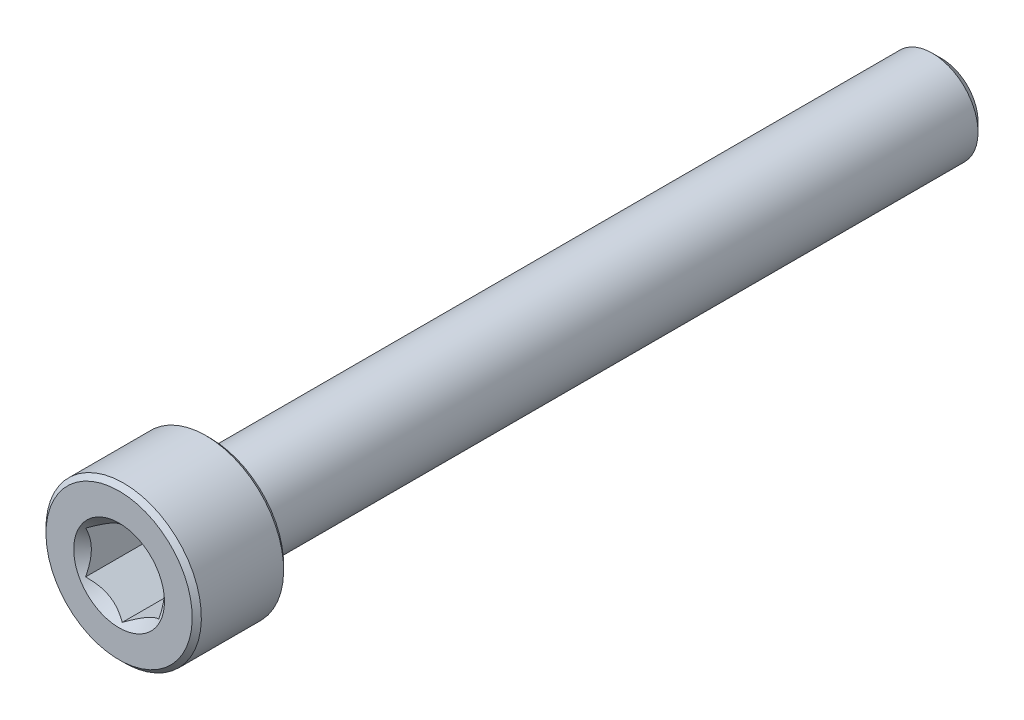
ISO-10303-21;
HEADER;
FILE_DESCRIPTION(('STEP AP214'),'2;1');
FILE_NAME('part.step','',(''),(''),'','','');
FILE_SCHEMA(('AUTOMOTIVE_DESIGN { 1 0 10303 214 1 1 1 1 }'));
ENDSEC;
DATA;
#1=APPLICATION_CONTEXT('core data for automotive mechanical design processes');
#2=APPLICATION_PROTOCOL_DEFINITION('international standard','automotive_design',2000,#1);
#3=PRODUCT_CONTEXT('',#1,'mechanical');
#4=PRODUCT('Part','Part','',(#3));
#5=PRODUCT_RELATED_PRODUCT_CATEGORY('part','',(#4));
#6=PRODUCT_DEFINITION_FORMATION('','',#4);
#7=PRODUCT_DEFINITION_CONTEXT('part definition',#1,'design');
#8=PRODUCT_DEFINITION('design','',#6,#7);
#9=PRODUCT_DEFINITION_SHAPE('','',#8);
#10=(LENGTH_UNIT() NAMED_UNIT(*) SI_UNIT(.MILLI.,.METRE.));
#11=(NAMED_UNIT(*) PLANE_ANGLE_UNIT() SI_UNIT($,.RADIAN.));
#12=(NAMED_UNIT(*) SI_UNIT($,.STERADIAN.) SOLID_ANGLE_UNIT());
#13=UNCERTAINTY_MEASURE_WITH_UNIT(LENGTH_MEASURE(1.E-05),#10,'distance_accuracy_value','');
#14=(GEOMETRIC_REPRESENTATION_CONTEXT(3) GLOBAL_UNCERTAINTY_ASSIGNED_CONTEXT((#13)) GLOBAL_UNIT_ASSIGNED_CONTEXT((#10,
#11,#12)) REPRESENTATION_CONTEXT('',''));
#15=CARTESIAN_POINT('',(0.,0.,0.));
#16=DIRECTION('',(0.,0.,1.));
#17=DIRECTION('',(1.,0.,0.));
#18=AXIS2_PLACEMENT_3D('',#15,#16,#17);
#19=CARTESIAN_POINT('',(0.,1.98038475772934,-22.5));
#20=DIRECTION('',(0.,0.,-1.));
#21=DIRECTION('',(0.,1.,0.));
#22=AXIS2_PLACEMENT_3D('',#19,#20,#21);
#23=PLANE('',#22);
#24=CARTESIAN_POINT('',(0.,0.,-22.5));
#25=DIRECTION('',(0.,0.,-1.));
#26=DIRECTION('',(0.,1.,0.));
#27=AXIS2_PLACEMENT_3D('',#24,#25,#26);
#28=CIRCLE('',#27,1.98038475772934);
#29=CARTESIAN_POINT('',(0.,1.98038475772934,-22.5));
#30=VERTEX_POINT('',#29);
#31=EDGE_CURVE('E61',#30,#30,#28,.T.);
#32=ORIENTED_EDGE('',*,*,#31,.T.);
#33=EDGE_LOOP('',(#32));
#34=FACE_BOUND('',#33,.T.);
#35=ADVANCED_FACE('F47',(#34),#23,.T.);
#36=CARTESIAN_POINT('',(0.,0.,-22.5));
#37=DIRECTION('',(0.,0.,1.));
#38=DIRECTION('',(0.,-1.,0.));
#39=AXIS2_PLACEMENT_3D('',#36,#37,#38);
#40=CONICAL_SURFACE('',#39,1.98038475772934,0.785398163397447);
#41=CARTESIAN_POINT('',(0.,0.,-21.9803847577293));
#42=DIRECTION('',(0.,0.,-1.));
#43=DIRECTION('',(0.,1.,0.));
#44=AXIS2_PLACEMENT_3D('',#41,#42,#43);
#45=CIRCLE('',#44,2.5);
#46=CARTESIAN_POINT('',(0.,2.5,-21.9803847577293));
#47=VERTEX_POINT('',#46);
#48=EDGE_CURVE('E179',#47,#47,#45,.T.);
#49=ORIENTED_EDGE('',*,*,#48,.T.);
#50=EDGE_LOOP('',(#49));
#51=FACE_BOUND('',#50,.T.);
#52=ORIENTED_EDGE('',*,*,#31,.F.);
#53=EDGE_LOOP('',(#52));
#54=FACE_BOUND('',#53,.T.);
#55=ADVANCED_FACE('F187',(#51,#54),#40,.T.);
#56=CARTESIAN_POINT('',(0.,0.,-22.5));
#57=DIRECTION('',(0.,0.,-1.));
#58=DIRECTION('',(0.,1.,0.));
#59=AXIS2_PLACEMENT_3D('',#56,#57,#58);
#60=CYLINDRICAL_SURFACE('',#59,2.5);
#61=CARTESIAN_POINT('',(0.,0.,17.25));
#62=DIRECTION('',(0.,0.,-1.));
#63=DIRECTION('',(0.,1.,0.));
#64=AXIS2_PLACEMENT_3D('',#61,#62,#63);
#65=CIRCLE('',#64,2.5);
#66=CARTESIAN_POINT('',(0.,2.5,17.25));
#67=VERTEX_POINT('',#66);
#68=EDGE_CURVE('E175',#67,#67,#65,.T.);
#69=ORIENTED_EDGE('',*,*,#68,.T.);
#70=EDGE_LOOP('',(#69));
#71=FACE_BOUND('',#70,.T.);
#72=ORIENTED_EDGE('',*,*,#48,.F.);
#73=EDGE_LOOP('',(#72));
#74=FACE_BOUND('',#73,.T.);
#75=ADVANCED_FACE('F189',(#71,#74),#60,.T.);
#76=CARTESIAN_POINT('',(0.,0.,17.25));
#77=DIRECTION('',(0.,0.,-1.));
#78=DIRECTION('',(0.,1.,0.));
#79=AXIS2_PLACEMENT_3D('',#76,#77,#78);
#80=TOROIDAL_SURFACE('',#79,2.75,0.25);
#81=CARTESIAN_POINT('',(0.,0.,17.5));
#82=DIRECTION('',(0.,0.,-1.));
#83=DIRECTION('',(0.,1.,0.));
#84=AXIS2_PLACEMENT_3D('',#81,#82,#83);
#85=CIRCLE('',#84,2.75);
#86=CARTESIAN_POINT('',(0.,2.75,17.5));
#87=VERTEX_POINT('',#86);
#88=EDGE_CURVE('E171',#87,#87,#85,.T.);
#89=ORIENTED_EDGE('',*,*,#88,.T.);
#90=EDGE_LOOP('',(#89));
#91=FACE_BOUND('',#90,.T.);
#92=ORIENTED_EDGE('',*,*,#68,.F.);
#93=EDGE_LOOP('',(#92));
#94=FACE_BOUND('',#93,.T.);
#95=ADVANCED_FACE('F195',(#91,#94),#80,.F.);
#96=CARTESIAN_POINT('',(0.,4.,17.5));
#97=DIRECTION('',(0.,0.,-1.));
#98=DIRECTION('',(0.,1.,0.));
#99=AXIS2_PLACEMENT_3D('',#96,#97,#98);
#100=PLANE('',#99);
#101=CARTESIAN_POINT('',(0.,0.,17.5));
#102=DIRECTION('',(0.,0.,-1.));
#103=DIRECTION('',(0.,1.,0.));
#104=AXIS2_PLACEMENT_3D('',#101,#102,#103);
#105=CIRCLE('',#104,4.);
#106=CARTESIAN_POINT('',(0.,4.,17.5));
#107=VERTEX_POINT('',#106);
#108=EDGE_CURVE('E167',#107,#107,#105,.T.);
#109=ORIENTED_EDGE('',*,*,#108,.T.);
#110=EDGE_LOOP('',(#109));
#111=FACE_BOUND('',#110,.T.);
#112=ORIENTED_EDGE('',*,*,#88,.F.);
#113=EDGE_LOOP('',(#112));
#114=FACE_BOUND('',#113,.T.);
#115=ADVANCED_FACE('F201',(#111,#114),#100,.T.);
#116=CARTESIAN_POINT('',(0.,0.,17.5));
#117=DIRECTION('',(0.,0.,1.));
#118=DIRECTION('',(0.,-1.,0.));
#119=AXIS2_PLACEMENT_3D('',#116,#117,#118);
#120=CONICAL_SURFACE('',#119,4.,0.785398163397448);
#121=CARTESIAN_POINT('',(0.,0.,17.75));
#122=DIRECTION('',(0.,0.,-1.));
#123=DIRECTION('',(0.,1.,0.));
#124=AXIS2_PLACEMENT_3D('',#121,#122,#123);
#125=CIRCLE('',#124,4.25);
#126=CARTESIAN_POINT('',(0.,4.25,17.75));
#127=VERTEX_POINT('',#126);
#128=EDGE_CURVE('E163',#127,#127,#125,.T.);
#129=ORIENTED_EDGE('',*,*,#128,.T.);
#130=EDGE_LOOP('',(#129));
#131=FACE_BOUND('',#130,.T.);
#132=ORIENTED_EDGE('',*,*,#108,.F.);
#133=EDGE_LOOP('',(#132));
#134=FACE_BOUND('',#133,.T.);
#135=ADVANCED_FACE('F205',(#131,#134),#120,.T.);
#136=CARTESIAN_POINT('',(0.,0.,-22.5));
#137=DIRECTION('',(0.,0.,-1.));
#138=DIRECTION('',(0.,1.,0.));
#139=AXIS2_PLACEMENT_3D('',#136,#137,#138);
#140=CYLINDRICAL_SURFACE('',#139,4.25);
#141=CARTESIAN_POINT('',(0.,0.,22.25));
#142=DIRECTION('',(0.,0.,-1.));
#143=DIRECTION('',(0.,1.,0.));
#144=AXIS2_PLACEMENT_3D('',#141,#142,#143);
#145=CIRCLE('',#144,4.25);
#146=CARTESIAN_POINT('',(0.,4.25,22.25));
#147=VERTEX_POINT('',#146);
#148=EDGE_CURVE('E159',#147,#147,#145,.T.);
#149=ORIENTED_EDGE('',*,*,#148,.T.);
#150=EDGE_LOOP('',(#149));
#151=FACE_BOUND('',#150,.T.);
#152=ORIENTED_EDGE('',*,*,#128,.F.);
#153=EDGE_LOOP('',(#152));
#154=FACE_BOUND('',#153,.T.);
#155=ADVANCED_FACE('F209',(#151,#154),#140,.T.);
#156=CARTESIAN_POINT('',(0.,0.,22.25));
#157=DIRECTION('',(0.,0.,-1.));
#158=DIRECTION('',(0.,1.,0.));
#159=AXIS2_PLACEMENT_3D('',#156,#157,#158);
#160=CONICAL_SURFACE('',#159,4.25,0.785398163397448);
#161=CARTESIAN_POINT('',(0.,0.,22.5));
#162=DIRECTION('',(0.,0.,-1.));
#163=DIRECTION('',(0.,1.,0.));
#164=AXIS2_PLACEMENT_3D('',#161,#162,#163);
#165=CIRCLE('',#164,4.);
#166=CARTESIAN_POINT('',(0.,4.,22.5));
#167=VERTEX_POINT('',#166);
#168=EDGE_CURVE('E155',#167,#167,#165,.T.);
#169=ORIENTED_EDGE('',*,*,#168,.T.);
#170=EDGE_LOOP('',(#169));
#171=FACE_BOUND('',#170,.T.);
#172=ORIENTED_EDGE('',*,*,#148,.F.);
#173=EDGE_LOOP('',(#172));
#174=FACE_BOUND('',#173,.T.);
#175=ADVANCED_FACE('F213',(#171,#174),#160,.T.);
#176=CARTESIAN_POINT('',(0.,0.,22.5));
#177=DIRECTION('',(0.,0.,1.));
#178=DIRECTION('',(0.,-1.,0.));
#179=AXIS2_PLACEMENT_3D('',#176,#177,#178);
#180=PLANE('',#179);
#181=CARTESIAN_POINT('',(0.,0.,22.5));
#182=DIRECTION('',(0.,0.,1.));
#183=DIRECTION('',(1.,0.,0.));
#184=AXIS2_PLACEMENT_3D('',#181,#182,#183);
#185=CIRCLE('',#184,2.48260615751539);
#186=CARTESIAN_POINT('',(2.48260615751539,0.,22.5));
#187=VERTEX_POINT('',#186);
#188=EDGE_CURVE('E121',#187,#187,#185,.T.);
#189=ORIENTED_EDGE('',*,*,#188,.F.);
#190=EDGE_LOOP('',(#189));
#191=FACE_BOUND('',#190,.T.);
#192=ORIENTED_EDGE('',*,*,#168,.F.);
#193=EDGE_LOOP('',(#192));
#194=FACE_BOUND('',#193,.T.);
#195=ADVANCED_FACE('F217',(#191,#194),#180,.T.);
#196=CARTESIAN_POINT('',(0.,0.,22.5));
#197=DIRECTION('',(0.,0.,1.));
#198=DIRECTION('',(1.,0.,0.));
#199=AXIS2_PLACEMENT_3D('',#196,#197,#198);
#200=CONICAL_SURFACE('',#199,2.48260615751539,0.78539816339745);
#201=ORIENTED_EDGE('',*,*,#188,.T.);
#202=EDGE_LOOP('',(#201));
#203=FACE_BOUND('',#202,.T.);
#204=CARTESIAN_POINT('',(-0.000199999999999327,-2.30951654681234,22.3269103979568));
#205=CARTESIAN_POINT('',(0.0685530340307063,-2.26982196410711,22.2872480094687));
#206=CARTESIAN_POINT('',(0.138455742135512,-2.22946361676572,22.2499149015273));
#207=CARTESIAN_POINT('',(0.280995244550436,-2.1471683966763,22.1815586043793));
#208=CARTESIAN_POINT('',(0.353645597565358,-2.10522369580642,22.1505734529803));
#209=CARTESIAN_POINT('',(0.500141601053971,-2.02064418875706,22.0974951357873));
#210=CARTESIAN_POINT('',(0.573949935246294,-1.97803092714269,22.0752685464197));
#211=CARTESIAN_POINT('',(0.723191631835263,-1.89186619344273,22.0410237359182));
#212=CARTESIAN_POINT('',(0.798620433918151,-1.84831735425552,22.0289799483872));
#213=CARTESIAN_POINT('',(0.928615500671078,-1.7732646674724,22.0181134311487));
#214=CARTESIAN_POINT('',(0.983013783970107,-1.74185780396625,22.0165046728531));
#215=CARTESIAN_POINT('',(1.09172145551969,-1.67909540053412,22.0192137968418));
#216=CARTESIAN_POINT('',(1.14603080592134,-1.64773988246022,22.0235337570011));
#217=CARTESIAN_POINT('',(1.25413672758934,-1.5853248994842,22.037854486653));
#218=CARTESIAN_POINT('',(1.30793265655479,-1.55426580541469,22.0478616120051));
#219=CARTESIAN_POINT('',(1.41459426230557,-1.49268469862228,22.0730073494928));
#220=CARTESIAN_POINT('',(1.46746001007071,-1.46216264491917,22.0881455682853));
#221=CARTESIAN_POINT('',(1.60287973308984,-1.38397803138049,22.1330894226723));
#222=CARTESIAN_POINT('',(1.68459383484948,-1.33680037273297,22.1662837586689));
#223=CARTESIAN_POINT('',(1.8047470372578,-1.26742988897853,22.2223207424145));
#224=CARTESIAN_POINT('',(1.84434285210918,-1.24456923461531,22.2420096221901));
#225=CARTESIAN_POINT('',(1.92280095888787,-1.19927142554652,22.283182237608));
#226=CARTESIAN_POINT('',(1.96166368359374,-1.17683402097614,22.3046648708944));
#227=CARTESIAN_POINT('',(2.0002,-1.15458506832541,22.3269103979568));
#228=B_SPLINE_CURVE_WITH_KNOTS('',3,(#204,#205,#206,#207,#208,#209,#210,#211,#212,#213,#214,
#215,#216,#217,#218,#219,#220,#221,#222,#223,#224,#225,#226,#227),.UNSPECIFIED.,.F.,.F.,(4,2,2,
2,2,2,2,2,2,2,2,4),(0.,0.266420613771063,0.534393751523388,0.798110374376913,1.06116288956936,
1.24939906803721,1.43770123566247,1.62621426093931,1.81471283831913,2.11415604834144,
2.2634717071779,2.41269626969771),.UNSPECIFIED.);
#229=CARTESIAN_POINT('',(0.,-2.3094010767585,22.3267949192431));
#230=VERTEX_POINT('',#229);
#231=CARTESIAN_POINT('',(2.,-1.15470053837925,22.3267949192431));
#232=VERTEX_POINT('',#231);
#233=EDGE_CURVE('E12',#230,#232,#228,.T.);
#234=ORIENTED_EDGE('',*,*,#233,.F.);
#235=CARTESIAN_POINT('',(-2.0002,-1.15458506832541,22.3269103979568));
#236=CARTESIAN_POINT('',(-1.93144696596929,-1.19427965103064,22.2872480094687));
#237=CARTESIAN_POINT('',(-1.86154425786449,-1.23463799837204,22.2499149015273));
#238=CARTESIAN_POINT('',(-1.71900475544956,-1.31693321846145,22.1815586043793));
#239=CARTESIAN_POINT('',(-1.64635440243464,-1.35887791933134,22.1505734529803));
#240=CARTESIAN_POINT('',(-1.49985839894603,-1.44345742638069,22.0974951357873));
#241=CARTESIAN_POINT('',(-1.42605006475371,-1.48607068799507,22.0752685464197));
#242=CARTESIAN_POINT('',(-1.27680836816474,-1.57223542169503,22.0410237359182));
#243=CARTESIAN_POINT('',(-1.20137956608185,-1.61578426088223,22.0289799483872));
#244=CARTESIAN_POINT('',(-1.07138449932892,-1.69083694766536,22.0181134311487));
#245=CARTESIAN_POINT('',(-1.01698621602989,-1.72224381117151,22.0165046728531));
#246=CARTESIAN_POINT('',(-0.908278544480307,-1.78500621460364,22.0192137968418));
#247=CARTESIAN_POINT('',(-0.853969194078661,-1.81636173267754,22.0235337570011));
#248=CARTESIAN_POINT('',(-0.745863272410662,-1.87877671565355,22.037854486653));
#249=CARTESIAN_POINT('',(-0.692067343445208,-1.90983580972306,22.0478616120051));
#250=CARTESIAN_POINT('',(-0.585405737694426,-1.97141691651547,22.0730073494928));
#251=CARTESIAN_POINT('',(-0.532539989929288,-2.00193897021859,22.0881455682854));
#252=CARTESIAN_POINT('',(-0.397120266910156,-2.08012358375727,22.1330894226723));
#253=CARTESIAN_POINT('',(-0.315406165150521,-2.12730124240478,22.1662837586689));
#254=CARTESIAN_POINT('',(-0.195252962742196,-2.19667172615922,22.2223207424145));
#255=CARTESIAN_POINT('',(-0.155657147890821,-2.21953238052245,22.2420096221901));
#256=CARTESIAN_POINT('',(-0.0771990411121255,-2.26483018959124,22.283182237608));
#257=CARTESIAN_POINT('',(-0.0383363164062574,-2.28726759416161,22.3046648708944));
#258=CARTESIAN_POINT('',(0.000200000000001438,-2.30951654681234,22.3269103979568));
#259=B_SPLINE_CURVE_WITH_KNOTS('',3,(#235,#236,#237,#238,#239,#240,#241,#242,#243,#244,#245,
#246,#247,#248,#249,#250,#251,#252,#253,#254,#255,#256,#257,#258),.UNSPECIFIED.,.F.,.F.,(4,2,2,
2,2,2,2,2,2,2,2,4),(0.,0.266420613771063,0.534393751523387,0.798110374376912,1.06116288956936,
1.24939906803721,1.43770123566247,1.62621426093931,1.81471283831913,2.11415604834145,
2.2634717071779,2.41269626969771),.UNSPECIFIED.);
#260=CARTESIAN_POINT('',(-2.,-1.15470053837925,22.3267949192431));
#261=VERTEX_POINT('',#260);
#262=EDGE_CURVE('E106',#261,#230,#259,.T.);
#263=ORIENTED_EDGE('',*,*,#262,.F.);
#264=CARTESIAN_POINT('',(-2.,-2.42398175579868,23.1599545105457));
#265=CARTESIAN_POINT('',(-2.,-2.3654738763041,23.1148351758713));
#266=CARTESIAN_POINT('',(-2.,-2.30665236661135,23.0701161756265));
#267=CARTESIAN_POINT('',(-2.,-2.18825331969084,22.9816622121418));
#268=CARTESIAN_POINT('',(-2.,-2.12867560822125,22.9379274823771));
#269=CARTESIAN_POINT('',(-2.,-2.00820019262835,22.8513142462896));
#270=CARTESIAN_POINT('',(-2.,-1.94729585350119,22.8084449389484));
#271=CARTESIAN_POINT('',(-2.,-1.82447635639412,22.7241846501668));
#272=CARTESIAN_POINT('',(-2.,-1.76256126823391,22.6827935672392));
#273=CARTESIAN_POINT('',(-2.,-1.63352305153315,22.5992199648467));
#274=CARTESIAN_POINT('',(-2.,-1.56632133333278,22.5571581799355));
#275=CARTESIAN_POINT('',(-2.,-1.43035896394453,22.4756383889365));
#276=CARTESIAN_POINT('',(-2.,-1.3615985170145,22.4361800443101));
#277=CARTESIAN_POINT('',(-2.,-1.22246684398892,22.3606863637627));
#278=CARTESIAN_POINT('',(-2.,-1.15210085009344,22.3246414605252));
#279=CARTESIAN_POINT('',(-2.,-1.00937086384545,22.2567889383446));
#280=CARTESIAN_POINT('',(-2.,-0.937007838648199,22.224979310286));
#281=CARTESIAN_POINT('',(-2.,-0.797532850709094,22.1696918996687));
#282=CARTESIAN_POINT('',(-2.,-0.730627867984569,22.1456972616385));
#283=CARTESIAN_POINT('',(-2.,-0.595101218410188,22.1030621374066));
#284=CARTESIAN_POINT('',(-2.,-0.526479443554563,22.0844219889886));
#285=CARTESIAN_POINT('',(-2.,-0.389131528451131,22.0538205255166));
#286=CARTESIAN_POINT('',(-2.,-0.320433088583214,22.0417369815865));
#287=CARTESIAN_POINT('',(-2.,-0.182167175628638,22.0245029259217));
#288=CARTESIAN_POINT('',(-2.,-0.112599890436884,22.0193509405131));
#289=CARTESIAN_POINT('',(-2.,0.0235742388197025,22.0164261236486));
#290=CARTESIAN_POINT('',(-2.,0.0901742622543203,22.0183334186349));
#291=CARTESIAN_POINT('',(-2.,0.222860647279178,22.0286844259992));
#292=CARTESIAN_POINT('',(-2.,0.288946962142555,22.037128726115));
#293=CARTESIAN_POINT('',(-2.,0.421249515605841,22.0602169544548));
#294=CARTESIAN_POINT('',(-2.,0.487446247340618,22.074970869731));
#295=CARTESIAN_POINT('',(-2.,0.61837553918038,22.1098579982816));
#296=CARTESIAN_POINT('',(-2.,0.683108176846778,22.1299909258717));
#297=CARTESIAN_POINT('',(-2.,0.881750195572361,22.199485149858));
#298=CARTESIAN_POINT('',(-2.,1.01295821830486,22.2565400033525));
#299=CARTESIAN_POINT('',(-2.,1.26925973679032,22.3835183967961));
#300=CARTESIAN_POINT('',(-2.,1.39432972284544,22.4534871660011));
#301=CARTESIAN_POINT('',(-2.,1.57512870977373,22.5627644548653));
#302=CARTESIAN_POINT('',(-2.,1.63281357796871,22.5989012241787));
#303=CARTESIAN_POINT('',(-2.,1.74719269140407,22.6727216099303));
#304=CARTESIAN_POINT('',(-2.,1.80388686201492,22.7104053421917));
#305=CARTESIAN_POINT('',(-2.,1.91595826038669,22.7867305219709));
#306=CARTESIAN_POINT('',(-2.,1.97134240267412,22.8253618677048));
#307=CARTESIAN_POINT('',(-2.,2.08135060816028,22.9036615543687));
#308=CARTESIAN_POINT('',(-2.,2.13597487670731,22.9433296064566));
#309=CARTESIAN_POINT('',(-2.,2.19028039622781,22.9834228737147));
#310=B_SPLINE_CURVE_WITH_KNOTS('',3,(#264,#265,#266,#267,#268,#269,#270,#271,#272,#273,#274,
#275,#276,#277,#278,#279,#280,#281,#282,#283,#284,#285,#286,#287,#288,#289,#290,#291,#292,#293,
#294,#295,#296,#297,#298,#299,#300,#301,#302,#303,#304,#305,#306,#307,#308,#309),.UNSPECIFIED.,
.F.,.F.,(4,2,2,2,2,2,2,2,2,2,2,2,2,2,2,2,2,2,2,2,2,2,4),(0.,0.221657667100341,0.443367370127326,
0.66678612572339,0.890189512941439,1.12798201434515,1.36574353320624,1.60281759521649,
1.83977879106023,2.05282811904838,2.26589088413717,2.47483185958036,2.68372840641277,
2.88327763021218,3.08284479743512,3.28604242448891,3.48922926167214,3.91721633282415,
4.34673183999752,4.55091998635568,4.75512344852471,4.95768958131487,5.16019986543559),.UNSPECIFIED.);
#311=CARTESIAN_POINT('',(-2.,1.15470053837925,22.3267949192431));
#312=VERTEX_POINT('',#311);
#313=EDGE_CURVE('E120',#312,#261,#310,.F.);
#314=ORIENTED_EDGE('',*,*,#313,.F.);
#315=CARTESIAN_POINT('',(0.000199999999999307,2.30951654681234,22.3269103979568));
#316=CARTESIAN_POINT('',(-0.0685530340307057,2.26982196410711,22.2872480094687));
#317=CARTESIAN_POINT('',(-0.138455742135512,2.22946361676572,22.2499149015273));
#318=CARTESIAN_POINT('',(-0.280995244550436,2.1471683966763,22.1815586043793));
#319=CARTESIAN_POINT('',(-0.353645597565358,2.10522369580642,22.1505734529803));
#320=CARTESIAN_POINT('',(-0.500141601053971,2.02064418875706,22.0974951357873));
#321=CARTESIAN_POINT('',(-0.573949935246294,1.97803092714269,22.0752685464197));
#322=CARTESIAN_POINT('',(-0.723191631835264,1.89186619344273,22.0410237359182));
#323=CARTESIAN_POINT('',(-0.798620433918152,1.84831735425552,22.0289799483872));
#324=CARTESIAN_POINT('',(-0.928615500671079,1.7732646674724,22.0181134311487));
#325=CARTESIAN_POINT('',(-0.983013783970109,1.74185780396625,22.0165046728531));
#326=CARTESIAN_POINT('',(-1.09172145551969,1.67909540053412,22.0192137968418));
#327=CARTESIAN_POINT('',(-1.14603080592134,1.64773988246021,22.0235337570011));
#328=CARTESIAN_POINT('',(-1.25413672758934,1.5853248994842,22.037854486653));
#329=CARTESIAN_POINT('',(-1.30793265655479,1.55426580541469,22.0478616120051));
#330=CARTESIAN_POINT('',(-1.41459426230557,1.49268469862228,22.0730073494928));
#331=CARTESIAN_POINT('',(-1.46746001007071,1.46216264491917,22.0881455682853));
#332=CARTESIAN_POINT('',(-1.60287973308984,1.38397803138049,22.1330894226723));
#333=CARTESIAN_POINT('',(-1.68459383484948,1.33680037273297,22.1662837586689));
#334=CARTESIAN_POINT('',(-1.8047470372578,1.26742988897853,22.2223207424145));
#335=CARTESIAN_POINT('',(-1.84434285210918,1.24456923461531,22.2420096221901));
#336=CARTESIAN_POINT('',(-1.92280095888787,1.19927142554652,22.283182237608));
#337=CARTESIAN_POINT('',(-1.96166368359374,1.17683402097614,22.3046648708944));
#338=CARTESIAN_POINT('',(-2.0002,1.15458506832541,22.3269103979568));
#339=B_SPLINE_CURVE_WITH_KNOTS('',3,(#315,#316,#317,#318,#319,#320,#321,#322,#323,#324,#325,
#326,#327,#328,#329,#330,#331,#332,#333,#334,#335,#336,#337,#338),.UNSPECIFIED.,.F.,.F.,(4,2,2,
2,2,2,2,2,2,2,2,4),(0.,0.266420613771063,0.534393751523387,0.798110374376912,1.06116288956936,
1.24939906803721,1.43770123566247,1.62621426093931,1.81471283831913,2.11415604834145,
2.2634717071779,2.41269626969771),.UNSPECIFIED.);
#340=CARTESIAN_POINT('',(0.,2.3094010767585,22.3267949192431));
#341=VERTEX_POINT('',#340);
#342=EDGE_CURVE('E268',#341,#312,#339,.T.);
#343=ORIENTED_EDGE('',*,*,#342,.F.);
#344=CARTESIAN_POINT('',(2.0002,1.15458506832541,22.3269103979568));
#345=CARTESIAN_POINT('',(1.93144696596929,1.19427965103065,22.2872480094687));
#346=CARTESIAN_POINT('',(1.86154425786449,1.23463799837204,22.2499149015273));
#347=CARTESIAN_POINT('',(1.71900475544956,1.31693321846145,22.1815586043793));
#348=CARTESIAN_POINT('',(1.64635440243464,1.35887791933134,22.1505734529803));
#349=CARTESIAN_POINT('',(1.49985839894603,1.44345742638069,22.0974951357873));
#350=CARTESIAN_POINT('',(1.42605006475371,1.48607068799507,22.0752685464197));
#351=CARTESIAN_POINT('',(1.27680836816474,1.57223542169503,22.0410237359182));
#352=CARTESIAN_POINT('',(1.20137956608185,1.61578426088223,22.0289799483872));
#353=CARTESIAN_POINT('',(1.07138449932892,1.69083694766536,22.0181134311487));
#354=CARTESIAN_POINT('',(1.01698621602989,1.72224381117151,22.0165046728531));
#355=CARTESIAN_POINT('',(0.908278544480306,1.78500621460364,22.0192137968418));
#356=CARTESIAN_POINT('',(0.853969194078661,1.81636173267754,22.0235337570011));
#357=CARTESIAN_POINT('',(0.745863272410662,1.87877671565355,22.037854486653));
#358=CARTESIAN_POINT('',(0.692067343445208,1.90983580972306,22.0478616120051));
#359=CARTESIAN_POINT('',(0.585405737694427,1.97141691651547,22.0730073494928));
#360=CARTESIAN_POINT('',(0.532539989929287,2.00193897021859,22.0881455682853));
#361=CARTESIAN_POINT('',(0.397120266910155,2.08012358375727,22.1330894226723));
#362=CARTESIAN_POINT('',(0.315406165150521,2.12730124240478,22.1662837586689));
#363=CARTESIAN_POINT('',(0.195252962742197,2.19667172615922,22.2223207424145));
#364=CARTESIAN_POINT('',(0.155657147890822,2.21953238052245,22.2420096221901));
#365=CARTESIAN_POINT('',(0.0771990411121271,2.26483018959124,22.283182237608));
#366=CARTESIAN_POINT('',(0.0383363164062592,2.28726759416161,22.3046648708944));
#367=CARTESIAN_POINT('',(-0.000200000000000474,2.30951654681234,22.3269103979568));
#368=B_SPLINE_CURVE_WITH_KNOTS('',3,(#344,#345,#346,#347,#348,#349,#350,#351,#352,#353,#354,
#355,#356,#357,#358,#359,#360,#361,#362,#363,#364,#365,#366,#367),.UNSPECIFIED.,.F.,.F.,(4,2,2,
2,2,2,2,2,2,2,2,4),(0.,0.266420613771064,0.534393751523387,0.798110374376913,1.06116288956936,
1.24939906803722,1.43770123566247,1.62621426093931,1.81471283831913,2.11415604834145,
2.2634717071779,2.41269626969771),.UNSPECIFIED.);
#369=CARTESIAN_POINT('',(2.,1.15470053837925,22.3267949192431));
#370=VERTEX_POINT('',#369);
#371=EDGE_CURVE('E241',#370,#341,#368,.T.);
#372=ORIENTED_EDGE('',*,*,#371,.F.);
#373=CARTESIAN_POINT('',(2.,-2.42398175579868,23.1599545105457));
#374=CARTESIAN_POINT('',(2.,-2.3654738763041,23.1148351758713));
#375=CARTESIAN_POINT('',(2.,-2.30665236661135,23.0701161756265));
#376=CARTESIAN_POINT('',(2.,-2.18825331969084,22.9816622121418));
#377=CARTESIAN_POINT('',(2.,-2.12867560822125,22.9379274823771));
#378=CARTESIAN_POINT('',(2.,-2.00820019262835,22.8513142462896));
#379=CARTESIAN_POINT('',(2.,-1.94729585350119,22.8084449389484));
#380=CARTESIAN_POINT('',(2.,-1.82447635639411,22.7241846501668));
#381=CARTESIAN_POINT('',(2.,-1.76256126823391,22.6827935672392));
#382=CARTESIAN_POINT('',(2.,-1.63352305153315,22.5992199648467));
#383=CARTESIAN_POINT('',(2.,-1.56632133333278,22.5571581799355));
#384=CARTESIAN_POINT('',(2.,-1.43035896394452,22.4756383889365));
#385=CARTESIAN_POINT('',(2.,-1.3615985170145,22.4361800443101));
#386=CARTESIAN_POINT('',(2.,-1.22246684398892,22.3606863637627));
#387=CARTESIAN_POINT('',(2.,-1.15210085009343,22.3246414605251));
#388=CARTESIAN_POINT('',(2.,-1.00937086384545,22.2567889383446));
#389=CARTESIAN_POINT('',(2.,-0.937007838648198,22.224979310286));
#390=CARTESIAN_POINT('',(2.,-0.797532850709093,22.1696918996687));
#391=CARTESIAN_POINT('',(2.,-0.730627867984567,22.1456972616385));
#392=CARTESIAN_POINT('',(2.,-0.595101218410186,22.1030621374066));
#393=CARTESIAN_POINT('',(2.,-0.526479443554561,22.0844219889886));
#394=CARTESIAN_POINT('',(2.,-0.389131528451129,22.0538205255166));
#395=CARTESIAN_POINT('',(2.,-0.320433088583211,22.0417369815865));
#396=CARTESIAN_POINT('',(2.,-0.182167175628635,22.0245029259217));
#397=CARTESIAN_POINT('',(2.,-0.11259989043688,22.0193509405131));
#398=CARTESIAN_POINT('',(2.,0.0235742388197059,22.0164261236486));
#399=CARTESIAN_POINT('',(2.,0.0901742622543237,22.0183334186349));
#400=CARTESIAN_POINT('',(2.,0.222860647279181,22.0286844259992));
#401=CARTESIAN_POINT('',(2.,0.288946962142558,22.037128726115));
#402=CARTESIAN_POINT('',(2.,0.421249515605844,22.0602169544548));
#403=CARTESIAN_POINT('',(2.,0.48744624734062,22.074970869731));
#404=CARTESIAN_POINT('',(2.,0.618375539180382,22.1098579982816));
#405=CARTESIAN_POINT('',(2.,0.68310817684678,22.1299909258717));
#406=CARTESIAN_POINT('',(2.,0.881750195572364,22.199485149858));
#407=CARTESIAN_POINT('',(2.,1.01295821830486,22.2565400033525));
#408=CARTESIAN_POINT('',(2.,1.26925973679032,22.3835183967961));
#409=CARTESIAN_POINT('',(2.,1.39432972284545,22.4534871660011));
#410=CARTESIAN_POINT('',(2.,1.57512870977373,22.5627644548654));
#411=CARTESIAN_POINT('',(2.,1.63281357796872,22.5989012241787));
#412=CARTESIAN_POINT('',(2.,1.74719269140407,22.6727216099303));
#413=CARTESIAN_POINT('',(2.,1.80388686201493,22.7104053421917));
#414=CARTESIAN_POINT('',(2.,1.91595826038669,22.7867305219709));
#415=CARTESIAN_POINT('',(2.,1.97134240267412,22.8253618677048));
#416=CARTESIAN_POINT('',(2.,2.08135060816028,22.9036615543687));
#417=CARTESIAN_POINT('',(2.,2.13597487670732,22.9433296064566));
#418=CARTESIAN_POINT('',(2.,2.19028039622782,22.9834228737147));
#419=B_SPLINE_CURVE_WITH_KNOTS('',3,(#373,#374,#375,#376,#377,#378,#379,#380,#381,#382,#383,
#384,#385,#386,#387,#388,#389,#390,#391,#392,#393,#394,#395,#396,#397,#398,#399,#400,#401,#402,
#403,#404,#405,#406,#407,#408,#409,#410,#411,#412,#413,#414,#415,#416,#417,#418),.UNSPECIFIED.,
.F.,.F.,(4,2,2,2,2,2,2,2,2,2,2,2,2,2,2,2,2,2,2,2,2,2,4),(0.,0.22165766710034,0.443367370127326,
0.666786125723391,0.890189512941441,1.12798201434515,1.36574353320624,1.60281759521649,
1.83977879106023,2.05282811904838,2.26589088413717,2.47483185958036,2.68372840641278,
2.88327763021218,3.08284479743512,3.28604242448891,3.48922926167214,3.91721633282416,
4.34673183999753,4.55091998635568,4.75512344852471,4.95768958131487,5.1601998654356),.UNSPECIFIED.);
#420=EDGE_CURVE('E68',#232,#370,#419,.T.);
#421=ORIENTED_EDGE('',*,*,#420,.F.);
#422=EDGE_LOOP('',(#234,#263,#314,#343,#372,#421));
#423=FACE_BOUND('',#422,.T.);
#424=ADVANCED_FACE('F105',(#203,#423),#200,.F.);
#425=CARTESIAN_POINT('',(0.,4.,18.5));
#426=DIRECTION('',(0.,0.,-1.));
#427=DIRECTION('',(0.,1.,0.));
#428=AXIS2_PLACEMENT_3D('',#425,#426,#427);
#429=PLANE('',#428);
#430=DIRECTION('',(0.866025403784438,0.5,0.));
#431=VECTOR('',#430,1.);
#432=CARTESIAN_POINT('',(0.,-2.3094010767585,18.5));
#433=LINE('',#432,#431);
#434=CARTESIAN_POINT('',(0.,-2.3094010767585,18.5));
#435=VERTEX_POINT('',#434);
#436=CARTESIAN_POINT('',(2.,-1.15470053837925,18.5));
#437=VERTEX_POINT('',#436);
#438=EDGE_CURVE('E124',#435,#437,#433,.T.);
#439=ORIENTED_EDGE('',*,*,#438,.T.);
#440=DIRECTION('',(0.,1.,0.));
#441=VECTOR('',#440,1.);
#442=CARTESIAN_POINT('',(2.,-1.15470053837925,18.5));
#443=LINE('',#442,#441);
#444=CARTESIAN_POINT('',(2.,1.15470053837925,18.5));
#445=VERTEX_POINT('',#444);
#446=EDGE_CURVE('E75',#437,#445,#443,.T.);
#447=ORIENTED_EDGE('',*,*,#446,.T.);
#448=DIRECTION('',(-0.866025403784439,0.5,0.));
#449=VECTOR('',#448,1.);
#450=CARTESIAN_POINT('',(2.,1.15470053837925,18.5));
#451=LINE('',#450,#449);
#452=CARTESIAN_POINT('',(0.,2.3094010767585,18.5));
#453=VERTEX_POINT('',#452);
#454=EDGE_CURVE('E135',#445,#453,#451,.T.);
#455=ORIENTED_EDGE('',*,*,#454,.T.);
#456=DIRECTION('',(-0.866025403784439,-0.5,0.));
#457=VECTOR('',#456,1.);
#458=CARTESIAN_POINT('',(0.,2.3094010767585,18.5));
#459=LINE('',#458,#457);
#460=CARTESIAN_POINT('',(-2.,1.15470053837925,18.5));
#461=VERTEX_POINT('',#460);
#462=EDGE_CURVE('E144',#453,#461,#459,.T.);
#463=ORIENTED_EDGE('',*,*,#462,.T.);
#464=DIRECTION('',(0.,-1.,0.));
#465=VECTOR('',#464,1.);
#466=CARTESIAN_POINT('',(-2.,1.15470053837925,18.5));
#467=LINE('',#466,#465);
#468=CARTESIAN_POINT('',(-2.,-1.15470053837925,18.5));
#469=VERTEX_POINT('',#468);
#470=EDGE_CURVE('E139',#461,#469,#467,.T.);
#471=ORIENTED_EDGE('',*,*,#470,.T.);
#472=DIRECTION('',(0.866025403784439,-0.5,0.));
#473=VECTOR('',#472,1.);
#474=CARTESIAN_POINT('',(-2.,-1.15470053837925,18.5));
#475=LINE('',#474,#473);
#476=EDGE_CURVE('E126',#469,#435,#475,.T.);
#477=ORIENTED_EDGE('',*,*,#476,.T.);
#478=EDGE_LOOP('',(#439,#447,#455,#463,#471,#477));
#479=FACE_BOUND('',#478,.T.);
#480=ADVANCED_FACE('F222',(#479),#429,.F.);
#481=CARTESIAN_POINT('',(0.,-2.3094010767585,11.3898990733922));
#482=DIRECTION('',(0.5,-0.866025403784438,0.));
#483=DIRECTION('',(0.866025403784438,0.5,0.));
#484=AXIS2_PLACEMENT_3D('',#481,#482,#483);
#485=PLANE('',#484);
#486=DIRECTION('',(0.,0.,1.));
#487=VECTOR('',#486,1.);
#488=CARTESIAN_POINT('',(0.,-2.3094010767585,11.3898990733922));
#489=LINE('',#488,#487);
#490=EDGE_CURVE('E115',#435,#230,#489,.T.);
#491=ORIENTED_EDGE('',*,*,#490,.T.);
#492=ORIENTED_EDGE('',*,*,#233,.T.);
#493=DIRECTION('',(0.,0.,1.));
#494=VECTOR('',#493,1.);
#495=CARTESIAN_POINT('',(2.,-1.15470053837925,11.3898990733922));
#496=LINE('',#495,#494);
#497=EDGE_CURVE('E130',#437,#232,#496,.T.);
#498=ORIENTED_EDGE('',*,*,#497,.F.);
#499=ORIENTED_EDGE('',*,*,#438,.F.);
#500=EDGE_LOOP('',(#491,#492,#498,#499));
#501=FACE_BOUND('',#500,.T.);
#502=ADVANCED_FACE('F123',(#501),#485,.F.);
#503=CARTESIAN_POINT('',(-2.,-1.15470053837925,11.3898990733922));
#504=DIRECTION('',(-0.5,-0.866025403784439,0.));
#505=DIRECTION('',(0.866025403784439,-0.5,0.));
#506=AXIS2_PLACEMENT_3D('',#503,#504,#505);
#507=PLANE('',#506);
#508=DIRECTION('',(0.,0.,1.));
#509=VECTOR('',#508,1.);
#510=CARTESIAN_POINT('',(-2.,-1.15470053837925,11.3898990733922));
#511=LINE('',#510,#509);
#512=EDGE_CURVE('E118',#469,#261,#511,.T.);
#513=ORIENTED_EDGE('',*,*,#512,.T.);
#514=ORIENTED_EDGE('',*,*,#262,.T.);
#515=ORIENTED_EDGE('',*,*,#490,.F.);
#516=ORIENTED_EDGE('',*,*,#476,.F.);
#517=EDGE_LOOP('',(#513,#514,#515,#516));
#518=FACE_BOUND('',#517,.T.);
#519=ADVANCED_FACE('F114',(#518),#507,.F.);
#520=CARTESIAN_POINT('',(-2.,1.15470053837925,11.3898990733922));
#521=DIRECTION('',(-1.,0.,0.));
#522=DIRECTION('',(0.,0.,1.));
#523=AXIS2_PLACEMENT_3D('',#520,#521,#522);
#524=PLANE('',#523);
#525=DIRECTION('',(0.,0.,1.));
#526=VECTOR('',#525,1.);
#527=CARTESIAN_POINT('',(-2.,1.15470053837925,11.3898990733922));
#528=LINE('',#527,#526);
#529=EDGE_CURVE('E140',#461,#312,#528,.T.);
#530=ORIENTED_EDGE('',*,*,#529,.T.);
#531=ORIENTED_EDGE('',*,*,#313,.T.);
#532=ORIENTED_EDGE('',*,*,#512,.F.);
#533=ORIENTED_EDGE('',*,*,#470,.F.);
#534=EDGE_LOOP('',(#530,#531,#532,#533));
#535=FACE_BOUND('',#534,.T.);
#536=ADVANCED_FACE('F278',(#535),#524,.F.);
#537=CARTESIAN_POINT('',(0.,2.3094010767585,11.3898990733922));
#538=DIRECTION('',(-0.5,0.866025403784438,0.));
#539=DIRECTION('',(-0.866025403784439,-0.5,0.));
#540=AXIS2_PLACEMENT_3D('',#537,#538,#539);
#541=PLANE('',#540);
#542=DIRECTION('',(0.,0.,1.));
#543=VECTOR('',#542,1.);
#544=CARTESIAN_POINT('',(0.,2.3094010767585,11.3898990733922));
#545=LINE('',#544,#543);
#546=EDGE_CURVE('E145',#453,#341,#545,.T.);
#547=ORIENTED_EDGE('',*,*,#546,.T.);
#548=ORIENTED_EDGE('',*,*,#342,.T.);
#549=ORIENTED_EDGE('',*,*,#529,.F.);
#550=ORIENTED_EDGE('',*,*,#462,.F.);
#551=EDGE_LOOP('',(#547,#548,#549,#550));
#552=FACE_BOUND('',#551,.T.);
#553=ADVANCED_FACE('F275',(#552),#541,.F.);
#554=CARTESIAN_POINT('',(2.,1.15470053837925,11.3898990733922));
#555=DIRECTION('',(0.5,0.866025403784439,0.));
#556=DIRECTION('',(-0.866025403784439,0.5,0.));
#557=AXIS2_PLACEMENT_3D('',#554,#555,#556);
#558=PLANE('',#557);
#559=DIRECTION('',(0.,0.,1.));
#560=VECTOR('',#559,1.);
#561=CARTESIAN_POINT('',(2.,1.15470053837925,11.3898990733922));
#562=LINE('',#561,#560);
#563=EDGE_CURVE('E149',#445,#370,#562,.T.);
#564=ORIENTED_EDGE('',*,*,#563,.T.);
#565=ORIENTED_EDGE('',*,*,#371,.T.);
#566=ORIENTED_EDGE('',*,*,#546,.F.);
#567=ORIENTED_EDGE('',*,*,#454,.F.);
#568=EDGE_LOOP('',(#564,#565,#566,#567));
#569=FACE_BOUND('',#568,.T.);
#570=ADVANCED_FACE('F230',(#569),#558,.F.);
#571=CARTESIAN_POINT('',(2.,-1.15470053837925,11.3898990733922));
#572=DIRECTION('',(1.,0.,0.));
#573=DIRECTION('',(0.,0.,-1.));
#574=AXIS2_PLACEMENT_3D('',#571,#572,#573);
#575=PLANE('',#574);
#576=ORIENTED_EDGE('',*,*,#497,.T.);
#577=ORIENTED_EDGE('',*,*,#420,.T.);
#578=ORIENTED_EDGE('',*,*,#563,.F.);
#579=ORIENTED_EDGE('',*,*,#446,.F.);
#580=EDGE_LOOP('',(#576,#577,#578,#579));
#581=FACE_BOUND('',#580,.T.);
#582=ADVANCED_FACE('F226',(#581),#575,.F.);
#583=CLOSED_SHELL('',(#35,#55,#75,#95,#115,#135,#155,#175,#195,#424,#480,#502,#519,#536,#553,
#570,#582));
#584=MANIFOLD_SOLID_BREP('B2',#583);
#585=ADVANCED_BREP_SHAPE_REPRESENTATION('',(#18,#584),#14);
#586=SHAPE_DEFINITION_REPRESENTATION(#9,#585);
ENDSEC;
END-ISO-10303-21;
